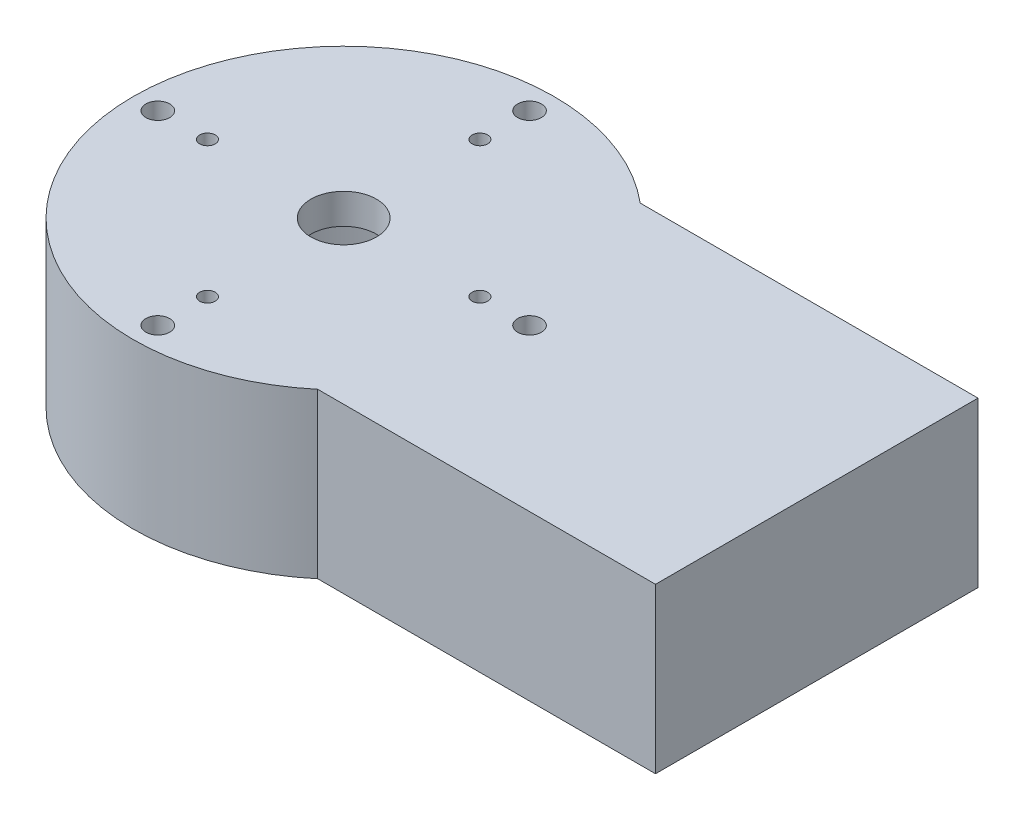
ISO-10303-21;
HEADER;
FILE_DESCRIPTION(('STEP AP214'),'2;1');
FILE_NAME('part.step','',(''),(''),'','','');
FILE_SCHEMA(('AUTOMOTIVE_DESIGN { 1 0 10303 214 1 1 1 1 }'));
ENDSEC;
DATA;
#1=APPLICATION_CONTEXT('core data for automotive mechanical design processes');
#2=APPLICATION_PROTOCOL_DEFINITION('international standard','automotive_design',2000,#1);
#3=PRODUCT_CONTEXT('',#1,'mechanical');
#4=PRODUCT('Part','Part','',(#3));
#5=PRODUCT_RELATED_PRODUCT_CATEGORY('part','',(#4));
#6=PRODUCT_DEFINITION_FORMATION('','',#4);
#7=PRODUCT_DEFINITION_CONTEXT('part definition',#1,'design');
#8=PRODUCT_DEFINITION('design','',#6,#7);
#9=PRODUCT_DEFINITION_SHAPE('','',#8);
#10=(LENGTH_UNIT() NAMED_UNIT(*) SI_UNIT(.MILLI.,.METRE.));
#11=(NAMED_UNIT(*) PLANE_ANGLE_UNIT() SI_UNIT($,.RADIAN.));
#12=(NAMED_UNIT(*) SI_UNIT($,.STERADIAN.) SOLID_ANGLE_UNIT());
#13=UNCERTAINTY_MEASURE_WITH_UNIT(LENGTH_MEASURE(1.E-05),#10,'distance_accuracy_value','');
#14=(GEOMETRIC_REPRESENTATION_CONTEXT(3) GLOBAL_UNCERTAINTY_ASSIGNED_CONTEXT((#13)) GLOBAL_UNIT_ASSIGNED_CONTEXT((#10,
#11,#12)) REPRESENTATION_CONTEXT('',''));
#15=CARTESIAN_POINT('',(0.,0.,0.));
#16=DIRECTION('',(0.,0.,1.));
#17=DIRECTION('',(1.,0.,0.));
#18=AXIS2_PLACEMENT_3D('',#15,#16,#17);
#19=CARTESIAN_POINT('',(0.,31.8,0.));
#20=DIRECTION('',(0.,-1.,0.));
#21=DIRECTION('',(0.,0.,-1.));
#22=AXIS2_PLACEMENT_3D('',#19,#20,#21);
#23=CYLINDRICAL_SURFACE('',#22,19.65);
#24=CARTESIAN_POINT('',(0.,16.3,0.));
#25=DIRECTION('',(0.,1.,0.));
#26=DIRECTION('',(0.,0.,1.));
#27=AXIS2_PLACEMENT_3D('',#24,#25,#26);
#28=CIRCLE('',#27,19.65);
#29=CARTESIAN_POINT('',(0.,16.3,19.65));
#30=VERTEX_POINT('',#29);
#31=EDGE_CURVE('E173',#30,#30,#28,.F.);
#32=ORIENTED_EDGE('',*,*,#31,.F.);
#33=EDGE_LOOP('',(#32));
#34=FACE_BOUND('',#33,.T.);
#35=CARTESIAN_POINT('',(0.,0.,0.));
#36=DIRECTION('',(0.,-1.,0.));
#37=DIRECTION('',(0.,0.,-1.));
#38=AXIS2_PLACEMENT_3D('',#35,#36,#37);
#39=CIRCLE('',#38,19.65);
#40=CARTESIAN_POINT('',(0.,0.,-19.65));
#41=VERTEX_POINT('',#40);
#42=EDGE_CURVE('E195',#41,#41,#39,.T.);
#43=ORIENTED_EDGE('',*,*,#42,.T.);
#44=EDGE_LOOP('',(#43));
#45=FACE_BOUND('',#44,.T.);
#46=ADVANCED_FACE('F47',(#34,#45),#23,.F.);
#47=CARTESIAN_POINT('',(0.,3.7,0.));
#48=DIRECTION('',(0.,-1.,0.));
#49=DIRECTION('',(0.,0.,-1.));
#50=AXIS2_PLACEMENT_3D('',#47,#48,#49);
#51=CYLINDRICAL_SURFACE('',#50,25.65);
#52=CARTESIAN_POINT('',(0.,20.,0.));
#53=DIRECTION('',(0.,1.,0.));
#54=DIRECTION('',(0.,0.,1.));
#55=AXIS2_PLACEMENT_3D('',#52,#53,#54);
#56=CIRCLE('',#55,25.65);
#57=CARTESIAN_POINT('',(16.4863579968409,20.,-19.65));
#58=VERTEX_POINT('',#57);
#59=CARTESIAN_POINT('',(16.4863579968409,20.,19.65));
#60=VERTEX_POINT('',#59);
#61=EDGE_CURVE('E63',#58,#60,#56,.T.);
#62=ORIENTED_EDGE('',*,*,#61,.F.);
#63=DIRECTION('',(0.,1.,0.));
#64=VECTOR('',#63,1.);
#65=CARTESIAN_POINT('',(16.4863579968409,0.,-19.65));
#66=LINE('',#65,#64);
#67=CARTESIAN_POINT('',(16.4863579968409,0.,-19.65));
#68=VERTEX_POINT('',#67);
#69=EDGE_CURVE('E110',#68,#58,#66,.T.);
#70=ORIENTED_EDGE('',*,*,#69,.F.);
#71=CARTESIAN_POINT('',(0.,0.,0.));
#72=DIRECTION('',(0.,1.,0.));
#73=DIRECTION('',(0.,0.,1.));
#74=AXIS2_PLACEMENT_3D('',#71,#72,#73);
#75=CIRCLE('',#74,25.65);
#76=CARTESIAN_POINT('',(16.4863579968409,0.,19.65));
#77=VERTEX_POINT('',#76);
#78=EDGE_CURVE('E11',#68,#77,#75,.T.);
#79=ORIENTED_EDGE('',*,*,#78,.T.);
#80=DIRECTION('',(0.,1.,0.));
#81=VECTOR('',#80,1.);
#82=CARTESIAN_POINT('',(16.4863579968409,0.,19.65));
#83=LINE('',#82,#81);
#84=EDGE_CURVE('E116',#77,#60,#83,.T.);
#85=ORIENTED_EDGE('',*,*,#84,.T.);
#86=EDGE_LOOP('',(#62,#70,#79,#85));
#87=FACE_BOUND('',#86,.T.);
#88=ADVANCED_FACE('F49',(#87),#51,.T.);
#89=CARTESIAN_POINT('',(0.,0.,22.65));
#90=DIRECTION('',(0.,1.,0.));
#91=DIRECTION('',(0.,0.,1.));
#92=AXIS2_PLACEMENT_3D('',#89,#90,#91);
#93=CYLINDRICAL_SURFACE('',#92,1.45);
#94=CARTESIAN_POINT('',(0.,0.,22.65));
#95=DIRECTION('',(0.,1.,0.));
#96=DIRECTION('',(0.,0.,1.));
#97=AXIS2_PLACEMENT_3D('',#94,#95,#96);
#98=CIRCLE('',#97,1.45);
#99=CARTESIAN_POINT('',(0.,0.,24.1));
#100=VERTEX_POINT('',#99);
#101=EDGE_CURVE('E114',#100,#100,#98,.T.);
#102=ORIENTED_EDGE('',*,*,#101,.F.);
#103=EDGE_LOOP('',(#102));
#104=FACE_BOUND('',#103,.T.);
#105=CARTESIAN_POINT('',(0.,20.,22.65));
#106=DIRECTION('',(0.,1.,0.));
#107=DIRECTION('',(0.,0.,1.));
#108=AXIS2_PLACEMENT_3D('',#105,#106,#107);
#109=CIRCLE('',#108,1.45);
#110=CARTESIAN_POINT('',(0.,20.,24.1));
#111=VERTEX_POINT('',#110);
#112=EDGE_CURVE('E119',#111,#111,#109,.F.);
#113=ORIENTED_EDGE('',*,*,#112,.F.);
#114=EDGE_LOOP('',(#113));
#115=FACE_BOUND('',#114,.T.);
#116=ADVANCED_FACE('F140',(#104,#115),#93,.F.);
#117=CARTESIAN_POINT('',(22.65,0.,0.));
#118=DIRECTION('',(0.,1.,0.));
#119=DIRECTION('',(0.,0.,1.));
#120=AXIS2_PLACEMENT_3D('',#117,#118,#119);
#121=CYLINDRICAL_SURFACE('',#120,1.45);
#122=CARTESIAN_POINT('',(22.65,0.,0.));
#123=DIRECTION('',(0.,1.,0.));
#124=DIRECTION('',(0.,0.,1.));
#125=AXIS2_PLACEMENT_3D('',#122,#123,#124);
#126=CIRCLE('',#125,1.45);
#127=CARTESIAN_POINT('',(22.65,0.,1.45));
#128=VERTEX_POINT('',#127);
#129=EDGE_CURVE('E132',#128,#128,#126,.T.);
#130=ORIENTED_EDGE('',*,*,#129,.F.);
#131=EDGE_LOOP('',(#130));
#132=FACE_BOUND('',#131,.T.);
#133=CARTESIAN_POINT('',(22.65,20.,0.));
#134=DIRECTION('',(0.,1.,0.));
#135=DIRECTION('',(0.,0.,1.));
#136=AXIS2_PLACEMENT_3D('',#133,#134,#135);
#137=CIRCLE('',#136,1.45);
#138=CARTESIAN_POINT('',(22.65,20.,1.45));
#139=VERTEX_POINT('',#138);
#140=EDGE_CURVE('E149',#139,#139,#137,.F.);
#141=ORIENTED_EDGE('',*,*,#140,.F.);
#142=EDGE_LOOP('',(#141));
#143=FACE_BOUND('',#142,.T.);
#144=ADVANCED_FACE('F143',(#132,#143),#121,.F.);
#145=CARTESIAN_POINT('',(2.37246156974391E-13,0.,-22.65));
#146=DIRECTION('',(0.,1.,0.));
#147=DIRECTION('',(0.,0.,1.));
#148=AXIS2_PLACEMENT_3D('',#145,#146,#147);
#149=CYLINDRICAL_SURFACE('',#148,1.45);
#150=CARTESIAN_POINT('',(2.37246156974391E-13,0.,-22.65));
#151=DIRECTION('',(0.,1.,0.));
#152=DIRECTION('',(0.,0.,1.));
#153=AXIS2_PLACEMENT_3D('',#150,#151,#152);
#154=CIRCLE('',#153,1.45);
#155=CARTESIAN_POINT('',(2.37246156974391E-13,0.,-21.2));
#156=VERTEX_POINT('',#155);
#157=EDGE_CURVE('E128',#156,#156,#154,.T.);
#158=ORIENTED_EDGE('',*,*,#157,.F.);
#159=EDGE_LOOP('',(#158));
#160=FACE_BOUND('',#159,.T.);
#161=CARTESIAN_POINT('',(2.37246156974391E-13,20.,-22.65));
#162=DIRECTION('',(0.,1.,0.));
#163=DIRECTION('',(0.,0.,1.));
#164=AXIS2_PLACEMENT_3D('',#161,#162,#163);
#165=CIRCLE('',#164,1.45);
#166=CARTESIAN_POINT('',(2.37246156974391E-13,20.,-21.2));
#167=VERTEX_POINT('',#166);
#168=EDGE_CURVE('E152',#167,#167,#165,.F.);
#169=ORIENTED_EDGE('',*,*,#168,.F.);
#170=EDGE_LOOP('',(#169));
#171=FACE_BOUND('',#170,.T.);
#172=ADVANCED_FACE('F248',(#160,#171),#149,.F.);
#173=CARTESIAN_POINT('',(-22.65,0.,-1.58164104649594E-13));
#174=DIRECTION('',(0.,1.,0.));
#175=DIRECTION('',(0.,0.,1.));
#176=AXIS2_PLACEMENT_3D('',#173,#174,#175);
#177=CYLINDRICAL_SURFACE('',#176,1.45);
#178=CARTESIAN_POINT('',(-22.65,0.,-1.58164104649594E-13));
#179=DIRECTION('',(0.,1.,0.));
#180=DIRECTION('',(0.,0.,1.));
#181=AXIS2_PLACEMENT_3D('',#178,#179,#180);
#182=CIRCLE('',#181,1.45);
#183=CARTESIAN_POINT('',(-22.65,0.,1.44999999999984));
#184=VERTEX_POINT('',#183);
#185=EDGE_CURVE('E56',#184,#184,#182,.T.);
#186=ORIENTED_EDGE('',*,*,#185,.F.);
#187=EDGE_LOOP('',(#186));
#188=FACE_BOUND('',#187,.T.);
#189=CARTESIAN_POINT('',(-22.65,20.,-1.58164104649594E-13));
#190=DIRECTION('',(0.,1.,0.));
#191=DIRECTION('',(0.,0.,1.));
#192=AXIS2_PLACEMENT_3D('',#189,#190,#191);
#193=CIRCLE('',#192,1.45);
#194=CARTESIAN_POINT('',(-22.65,20.,1.44999999999984));
#195=VERTEX_POINT('',#194);
#196=EDGE_CURVE('E157',#195,#195,#193,.F.);
#197=ORIENTED_EDGE('',*,*,#196,.F.);
#198=EDGE_LOOP('',(#197));
#199=FACE_BOUND('',#198,.T.);
#200=ADVANCED_FACE('F241',(#188,#199),#177,.F.);
#201=CARTESIAN_POINT('',(0.,0.,0.));
#202=DIRECTION('',(0.,1.,0.));
#203=DIRECTION('',(0.,0.,1.));
#204=AXIS2_PLACEMENT_3D('',#201,#202,#203);
#205=PLANE('',#204);
#206=ORIENTED_EDGE('',*,*,#42,.F.);
#207=EDGE_LOOP('',(#206));
#208=FACE_BOUND('',#207,.T.);
#209=ORIENTED_EDGE('',*,*,#185,.T.);
#210=EDGE_LOOP('',(#209));
#211=FACE_BOUND('',#210,.T.);
#212=ORIENTED_EDGE('',*,*,#157,.T.);
#213=EDGE_LOOP('',(#212));
#214=FACE_BOUND('',#213,.T.);
#215=ORIENTED_EDGE('',*,*,#129,.T.);
#216=EDGE_LOOP('',(#215));
#217=FACE_BOUND('',#216,.T.);
#218=ORIENTED_EDGE('',*,*,#101,.T.);
#219=EDGE_LOOP('',(#218));
#220=FACE_BOUND('',#219,.T.);
#221=DIRECTION('',(1.,0.,0.));
#222=VECTOR('',#221,1.);
#223=CARTESIAN_POINT('',(112.911357996841,0.,-19.65));
#224=LINE('',#223,#222);
#225=CARTESIAN_POINT('',(57.65,0.,-19.65));
#226=VERTEX_POINT('',#225);
#227=EDGE_CURVE('E103',#68,#226,#224,.T.);
#228=ORIENTED_EDGE('',*,*,#227,.T.);
#229=DIRECTION('',(0.,0.,1.));
#230=VECTOR('',#229,1.);
#231=CARTESIAN_POINT('',(57.65,0.,-19.65));
#232=LINE('',#231,#230);
#233=CARTESIAN_POINT('',(57.65,0.,19.65));
#234=VERTEX_POINT('',#233);
#235=EDGE_CURVE('E88',#226,#234,#232,.T.);
#236=ORIENTED_EDGE('',*,*,#235,.T.);
#237=DIRECTION('',(-1.,0.,0.));
#238=VECTOR('',#237,1.);
#239=CARTESIAN_POINT('',(112.911357996841,0.,19.65));
#240=LINE('',#239,#238);
#241=EDGE_CURVE('E71',#234,#77,#240,.T.);
#242=ORIENTED_EDGE('',*,*,#241,.T.);
#243=ORIENTED_EDGE('',*,*,#78,.F.);
#244=EDGE_LOOP('',(#228,#236,#242,#243));
#245=FACE_BOUND('',#244,.T.);
#246=ADVANCED_FACE('F107',(#208,#211,#214,#217,#220,#245),#205,.F.);
#247=CARTESIAN_POINT('',(112.911357996841,0.,-19.65));
#248=DIRECTION('',(0.,0.,1.));
#249=DIRECTION('',(1.,0.,0.));
#250=AXIS2_PLACEMENT_3D('',#247,#248,#249);
#251=PLANE('',#250);
#252=DIRECTION('',(-1.,0.,0.));
#253=VECTOR('',#252,1.);
#254=CARTESIAN_POINT('',(57.65,20.,-19.65));
#255=LINE('',#254,#253);
#256=CARTESIAN_POINT('',(57.65,20.,-19.65));
#257=VERTEX_POINT('',#256);
#258=EDGE_CURVE('E104',#257,#58,#255,.T.);
#259=ORIENTED_EDGE('',*,*,#258,.F.);
#260=DIRECTION('',(0.,-1.,0.));
#261=VECTOR('',#260,1.);
#262=CARTESIAN_POINT('',(57.65,31.8,-19.65));
#263=LINE('',#262,#261);
#264=EDGE_CURVE('E91',#257,#226,#263,.T.);
#265=ORIENTED_EDGE('',*,*,#264,.T.);
#266=ORIENTED_EDGE('',*,*,#227,.F.);
#267=ORIENTED_EDGE('',*,*,#69,.T.);
#268=EDGE_LOOP('',(#259,#265,#266,#267));
#269=FACE_BOUND('',#268,.T.);
#270=ADVANCED_FACE('F101',(#269),#251,.F.);
#271=CARTESIAN_POINT('',(112.911357996841,0.,19.65));
#272=DIRECTION('',(0.,0.,-1.));
#273=DIRECTION('',(-1.,0.,0.));
#274=AXIS2_PLACEMENT_3D('',#271,#272,#273);
#275=PLANE('',#274);
#276=ORIENTED_EDGE('',*,*,#241,.F.);
#277=DIRECTION('',(0.,1.,0.));
#278=VECTOR('',#277,1.);
#279=CARTESIAN_POINT('',(57.65,31.8,19.65));
#280=LINE('',#279,#278);
#281=CARTESIAN_POINT('',(57.65,20.,19.65));
#282=VERTEX_POINT('',#281);
#283=EDGE_CURVE('E94',#234,#282,#280,.T.);
#284=ORIENTED_EDGE('',*,*,#283,.T.);
#285=DIRECTION('',(1.,0.,0.));
#286=VECTOR('',#285,1.);
#287=CARTESIAN_POINT('',(16.4863579968409,20.,19.65));
#288=LINE('',#287,#286);
#289=EDGE_CURVE('E166',#60,#282,#288,.T.);
#290=ORIENTED_EDGE('',*,*,#289,.F.);
#291=ORIENTED_EDGE('',*,*,#84,.F.);
#292=EDGE_LOOP('',(#276,#284,#290,#291));
#293=FACE_BOUND('',#292,.T.);
#294=ADVANCED_FACE('F223',(#293),#275,.F.);
#295=CARTESIAN_POINT('',(0.,20.,0.));
#296=DIRECTION('',(0.,1.,0.));
#297=DIRECTION('',(0.,0.,1.));
#298=AXIS2_PLACEMENT_3D('',#295,#296,#297);
#299=PLANE('',#298);
#300=ORIENTED_EDGE('',*,*,#258,.T.);
#301=ORIENTED_EDGE('',*,*,#61,.T.);
#302=ORIENTED_EDGE('',*,*,#289,.T.);
#303=DIRECTION('',(0.,0.,-1.));
#304=VECTOR('',#303,1.);
#305=CARTESIAN_POINT('',(57.65,20.,-19.65));
#306=LINE('',#305,#304);
#307=EDGE_CURVE('E163',#282,#257,#306,.T.);
#308=ORIENTED_EDGE('',*,*,#307,.T.);
#309=EDGE_LOOP('',(#300,#301,#302,#308));
#310=FACE_BOUND('',#309,.T.);
#311=ORIENTED_EDGE('',*,*,#196,.T.);
#312=EDGE_LOOP('',(#311));
#313=FACE_BOUND('',#312,.T.);
#314=ORIENTED_EDGE('',*,*,#168,.T.);
#315=EDGE_LOOP('',(#314));
#316=FACE_BOUND('',#315,.T.);
#317=ORIENTED_EDGE('',*,*,#140,.T.);
#318=EDGE_LOOP('',(#317));
#319=FACE_BOUND('',#318,.T.);
#320=ORIENTED_EDGE('',*,*,#112,.T.);
#321=EDGE_LOOP('',(#320));
#322=FACE_BOUND('',#321,.T.);
#323=CARTESIAN_POINT('',(16.6,20.,0.));
#324=DIRECTION('',(0.,1.,0.));
#325=DIRECTION('',(0.,0.,1.));
#326=AXIS2_PLACEMENT_3D('',#323,#324,#325);
#327=CIRCLE('',#326,0.950000000000001);
#328=CARTESIAN_POINT('',(16.6,20.,0.950000000000001));
#329=VERTEX_POINT('',#328);
#330=EDGE_CURVE('E191',#329,#329,#327,.T.);
#331=ORIENTED_EDGE('',*,*,#330,.F.);
#332=EDGE_LOOP('',(#331));
#333=FACE_BOUND('',#332,.T.);
#334=CARTESIAN_POINT('',(0.,20.,16.6));
#335=DIRECTION('',(0.,1.,0.));
#336=DIRECTION('',(0.,0.,1.));
#337=AXIS2_PLACEMENT_3D('',#334,#335,#336);
#338=CIRCLE('',#337,0.95);
#339=CARTESIAN_POINT('',(0.,20.,17.55));
#340=VERTEX_POINT('',#339);
#341=EDGE_CURVE('E187',#340,#340,#338,.T.);
#342=ORIENTED_EDGE('',*,*,#341,.F.);
#343=EDGE_LOOP('',(#342));
#344=FACE_BOUND('',#343,.T.);
#345=CARTESIAN_POINT('',(-16.6,20.,-1.15917180449592E-13));
#346=DIRECTION('',(0.,1.,0.));
#347=DIRECTION('',(0.,0.,1.));
#348=AXIS2_PLACEMENT_3D('',#345,#346,#347);
#349=CIRCLE('',#348,0.950000000000004);
#350=CARTESIAN_POINT('',(-16.6,20.,0.949999999999888));
#351=VERTEX_POINT('',#350);
#352=EDGE_CURVE('E183',#351,#351,#349,.T.);
#353=ORIENTED_EDGE('',*,*,#352,.F.);
#354=EDGE_LOOP('',(#353));
#355=FACE_BOUND('',#354,.T.);
#356=CARTESIAN_POINT('',(1.73875770674388E-13,20.,-16.6));
#357=DIRECTION('',(0.,1.,0.));
#358=DIRECTION('',(0.,0.,1.));
#359=AXIS2_PLACEMENT_3D('',#356,#357,#358);
#360=CIRCLE('',#359,0.950000000000001);
#361=CARTESIAN_POINT('',(1.73875770674388E-13,20.,-15.65));
#362=VERTEX_POINT('',#361);
#363=EDGE_CURVE('E179',#362,#362,#360,.T.);
#364=ORIENTED_EDGE('',*,*,#363,.F.);
#365=EDGE_LOOP('',(#364));
#366=FACE_BOUND('',#365,.T.);
#367=CARTESIAN_POINT('',(0.,20.,0.));
#368=DIRECTION('',(0.,1.,0.));
#369=DIRECTION('',(0.,0.,1.));
#370=AXIS2_PLACEMENT_3D('',#367,#368,#369);
#371=CIRCLE('',#370,4.);
#372=CARTESIAN_POINT('',(0.,20.,4.));
#373=VERTEX_POINT('',#372);
#374=EDGE_CURVE('E174',#373,#373,#371,.T.);
#375=ORIENTED_EDGE('',*,*,#374,.F.);
#376=EDGE_LOOP('',(#375));
#377=FACE_BOUND('',#376,.T.);
#378=ADVANCED_FACE('F225',(#310,#313,#316,#319,#322,#333,#344,#355,#366,#377),#299,.T.);
#379=CARTESIAN_POINT('',(0.,16.3,0.));
#380=DIRECTION('',(0.,1.,0.));
#381=DIRECTION('',(0.,0.,1.));
#382=AXIS2_PLACEMENT_3D('',#379,#380,#381);
#383=CYLINDRICAL_SURFACE('',#382,4.);
#384=CARTESIAN_POINT('',(0.,16.3,0.));
#385=DIRECTION('',(0.,1.,0.));
#386=DIRECTION('',(0.,0.,1.));
#387=AXIS2_PLACEMENT_3D('',#384,#385,#386);
#388=CIRCLE('',#387,4.);
#389=CARTESIAN_POINT('',(0.,16.3,4.));
#390=VERTEX_POINT('',#389);
#391=EDGE_CURVE('E199',#390,#390,#388,.T.);
#392=ORIENTED_EDGE('',*,*,#391,.F.);
#393=EDGE_LOOP('',(#392));
#394=FACE_BOUND('',#393,.T.);
#395=ORIENTED_EDGE('',*,*,#374,.T.);
#396=EDGE_LOOP('',(#395));
#397=FACE_BOUND('',#396,.T.);
#398=ADVANCED_FACE('F271',(#394,#397),#383,.F.);
#399=CARTESIAN_POINT('',(1.73875770674388E-13,16.3,-16.6));
#400=DIRECTION('',(0.,1.,0.));
#401=DIRECTION('',(0.,0.,1.));
#402=AXIS2_PLACEMENT_3D('',#399,#400,#401);
#403=CYLINDRICAL_SURFACE('',#402,0.950000000000001);
#404=CARTESIAN_POINT('',(1.73875770674388E-13,16.3,-16.6));
#405=DIRECTION('',(0.,1.,0.));
#406=DIRECTION('',(0.,0.,1.));
#407=AXIS2_PLACEMENT_3D('',#404,#405,#406);
#408=CIRCLE('',#407,0.950000000000001);
#409=CARTESIAN_POINT('',(1.73875770674388E-13,16.3,-15.65));
#410=VERTEX_POINT('',#409);
#411=EDGE_CURVE('E203',#410,#410,#408,.T.);
#412=ORIENTED_EDGE('',*,*,#411,.F.);
#413=EDGE_LOOP('',(#412));
#414=FACE_BOUND('',#413,.T.);
#415=ORIENTED_EDGE('',*,*,#363,.T.);
#416=EDGE_LOOP('',(#415));
#417=FACE_BOUND('',#416,.T.);
#418=ADVANCED_FACE('F284',(#414,#417),#403,.F.);
#419=CARTESIAN_POINT('',(-16.6,16.3,-1.15917180449592E-13));
#420=DIRECTION('',(0.,1.,0.));
#421=DIRECTION('',(0.,0.,1.));
#422=AXIS2_PLACEMENT_3D('',#419,#420,#421);
#423=CYLINDRICAL_SURFACE('',#422,0.950000000000004);
#424=CARTESIAN_POINT('',(-16.6,16.3,-1.15917180449592E-13));
#425=DIRECTION('',(0.,1.,0.));
#426=DIRECTION('',(0.,0.,1.));
#427=AXIS2_PLACEMENT_3D('',#424,#425,#426);
#428=CIRCLE('',#427,0.950000000000004);
#429=CARTESIAN_POINT('',(-16.6,16.3,0.949999999999888));
#430=VERTEX_POINT('',#429);
#431=EDGE_CURVE('E207',#430,#430,#428,.T.);
#432=ORIENTED_EDGE('',*,*,#431,.F.);
#433=EDGE_LOOP('',(#432));
#434=FACE_BOUND('',#433,.T.);
#435=ORIENTED_EDGE('',*,*,#352,.T.);
#436=EDGE_LOOP('',(#435));
#437=FACE_BOUND('',#436,.T.);
#438=ADVANCED_FACE('F280',(#434,#437),#423,.F.);
#439=CARTESIAN_POINT('',(0.,16.3,16.6));
#440=DIRECTION('',(0.,1.,0.));
#441=DIRECTION('',(0.,0.,1.));
#442=AXIS2_PLACEMENT_3D('',#439,#440,#441);
#443=CYLINDRICAL_SURFACE('',#442,0.95);
#444=CARTESIAN_POINT('',(0.,16.3,16.6));
#445=DIRECTION('',(0.,1.,0.));
#446=DIRECTION('',(0.,0.,1.));
#447=AXIS2_PLACEMENT_3D('',#444,#445,#446);
#448=CIRCLE('',#447,0.95);
#449=CARTESIAN_POINT('',(0.,16.3,17.55));
#450=VERTEX_POINT('',#449);
#451=EDGE_CURVE('E211',#450,#450,#448,.T.);
#452=ORIENTED_EDGE('',*,*,#451,.F.);
#453=EDGE_LOOP('',(#452));
#454=FACE_BOUND('',#453,.T.);
#455=ORIENTED_EDGE('',*,*,#341,.T.);
#456=EDGE_LOOP('',(#455));
#457=FACE_BOUND('',#456,.T.);
#458=ADVANCED_FACE('F276',(#454,#457),#443,.F.);
#459=CARTESIAN_POINT('',(16.6,16.3,0.));
#460=DIRECTION('',(0.,1.,0.));
#461=DIRECTION('',(0.,0.,1.));
#462=AXIS2_PLACEMENT_3D('',#459,#460,#461);
#463=CYLINDRICAL_SURFACE('',#462,0.950000000000001);
#464=CARTESIAN_POINT('',(16.6,16.3,0.));
#465=DIRECTION('',(0.,1.,0.));
#466=DIRECTION('',(0.,0.,1.));
#467=AXIS2_PLACEMENT_3D('',#464,#465,#466);
#468=CIRCLE('',#467,0.950000000000001);
#469=CARTESIAN_POINT('',(16.6,16.3,0.950000000000001));
#470=VERTEX_POINT('',#469);
#471=EDGE_CURVE('E178',#470,#470,#468,.T.);
#472=ORIENTED_EDGE('',*,*,#471,.F.);
#473=EDGE_LOOP('',(#472));
#474=FACE_BOUND('',#473,.T.);
#475=ORIENTED_EDGE('',*,*,#330,.T.);
#476=EDGE_LOOP('',(#475));
#477=FACE_BOUND('',#476,.T.);
#478=ADVANCED_FACE('F272',(#474,#477),#463,.F.);
#479=CARTESIAN_POINT('',(0.,16.3,0.));
#480=DIRECTION('',(0.,1.,0.));
#481=DIRECTION('',(0.,0.,1.));
#482=AXIS2_PLACEMENT_3D('',#479,#480,#481);
#483=PLANE('',#482);
#484=ORIENTED_EDGE('',*,*,#471,.T.);
#485=EDGE_LOOP('',(#484));
#486=FACE_BOUND('',#485,.T.);
#487=ORIENTED_EDGE('',*,*,#451,.T.);
#488=EDGE_LOOP('',(#487));
#489=FACE_BOUND('',#488,.T.);
#490=ORIENTED_EDGE('',*,*,#431,.T.);
#491=EDGE_LOOP('',(#490));
#492=FACE_BOUND('',#491,.T.);
#493=ORIENTED_EDGE('',*,*,#411,.T.);
#494=EDGE_LOOP('',(#493));
#495=FACE_BOUND('',#494,.T.);
#496=ORIENTED_EDGE('',*,*,#391,.T.);
#497=EDGE_LOOP('',(#496));
#498=FACE_BOUND('',#497,.T.);
#499=ORIENTED_EDGE('',*,*,#31,.T.);
#500=EDGE_LOOP('',(#499));
#501=FACE_BOUND('',#500,.T.);
#502=ADVANCED_FACE('F275',(#486,#489,#492,#495,#498,#501),#483,.F.);
#503=CARTESIAN_POINT('',(57.65,0.,0.));
#504=DIRECTION('',(-1.,0.,0.));
#505=DIRECTION('',(0.,0.,1.));
#506=AXIS2_PLACEMENT_3D('',#503,#504,#505);
#507=PLANE('',#506);
#508=ORIENTED_EDGE('',*,*,#307,.F.);
#509=ORIENTED_EDGE('',*,*,#283,.F.);
#510=ORIENTED_EDGE('',*,*,#235,.F.);
#511=ORIENTED_EDGE('',*,*,#264,.F.);
#512=EDGE_LOOP('',(#508,#509,#510,#511));
#513=FACE_BOUND('',#512,.T.);
#514=ADVANCED_FACE('F90',(#513),#507,.F.);
#515=CLOSED_SHELL('',(#46,#88,#116,#144,#172,#200,#246,#270,#294,#378,#398,#418,#438,#458,#478,
#502,#514));
#516=MANIFOLD_SOLID_BREP('B2',#515);
#517=ADVANCED_BREP_SHAPE_REPRESENTATION('',(#18,#516),#14);
#518=SHAPE_DEFINITION_REPRESENTATION(#9,#517);
ENDSEC;
END-ISO-10303-21;
